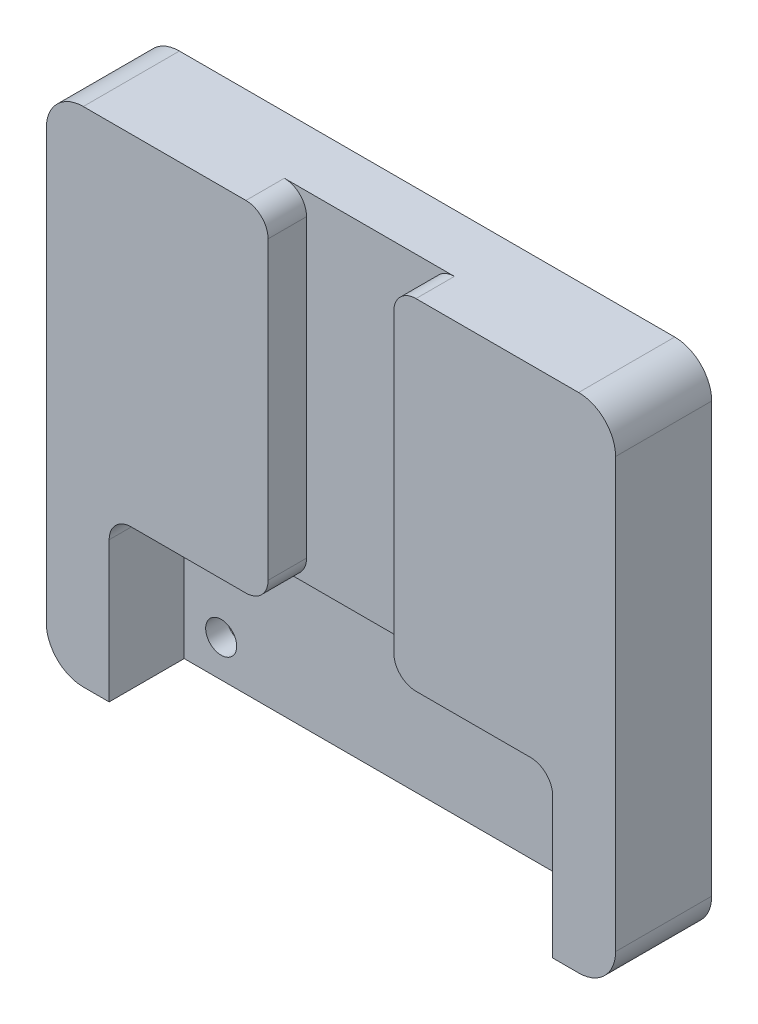
ISO-10303-21;
HEADER;
FILE_DESCRIPTION(('STEP AP214'),'2;1');
FILE_NAME('part.step','',(''),(''),'','','');
FILE_SCHEMA(('AUTOMOTIVE_DESIGN { 1 0 10303 214 1 1 1 1 }'));
ENDSEC;
DATA;
#1=APPLICATION_CONTEXT('core data for automotive mechanical design processes');
#2=APPLICATION_PROTOCOL_DEFINITION('international standard','automotive_design',2000,#1);
#3=PRODUCT_CONTEXT('',#1,'mechanical');
#4=PRODUCT('Part','Part','',(#3));
#5=PRODUCT_RELATED_PRODUCT_CATEGORY('part','',(#4));
#6=PRODUCT_DEFINITION_FORMATION('','',#4);
#7=PRODUCT_DEFINITION_CONTEXT('part definition',#1,'design');
#8=PRODUCT_DEFINITION('design','',#6,#7);
#9=PRODUCT_DEFINITION_SHAPE('','',#8);
#10=(LENGTH_UNIT() NAMED_UNIT(*) SI_UNIT(.MILLI.,.METRE.));
#11=(NAMED_UNIT(*) PLANE_ANGLE_UNIT() SI_UNIT($,.RADIAN.));
#12=(NAMED_UNIT(*) SI_UNIT($,.STERADIAN.) SOLID_ANGLE_UNIT());
#13=UNCERTAINTY_MEASURE_WITH_UNIT(LENGTH_MEASURE(1.E-05),#10,'distance_accuracy_value','');
#14=(GEOMETRIC_REPRESENTATION_CONTEXT(3) GLOBAL_UNCERTAINTY_ASSIGNED_CONTEXT((#13)) GLOBAL_UNIT_ASSIGNED_CONTEXT((#10,
#11,#12)) REPRESENTATION_CONTEXT('',''));
#15=CARTESIAN_POINT('',(0.,0.,0.));
#16=DIRECTION('',(0.,0.,1.));
#17=DIRECTION('',(1.,0.,0.));
#18=AXIS2_PLACEMENT_3D('',#15,#16,#17);
#19=CARTESIAN_POINT('',(77.,0.,13.));
#20=DIRECTION('',(0.,0.,-1.));
#21=DIRECTION('',(-1.,0.,0.));
#22=AXIS2_PLACEMENT_3D('',#19,#20,#21);
#23=PLANE('',#22);
#24=DIRECTION('',(0.,-1.,0.));
#25=VECTOR('',#24,1.);
#26=CARTESIAN_POINT('',(30.,68.,13.));
#27=LINE('',#26,#25);
#28=CARTESIAN_POINT('',(30.,65.,13.));
#29=VERTEX_POINT('',#28);
#30=CARTESIAN_POINT('',(30.,25.,13.));
#31=VERTEX_POINT('',#30);
#32=EDGE_CURVE('E408',#29,#31,#27,.T.);
#33=ORIENTED_EDGE('',*,*,#32,.F.);
#34=CARTESIAN_POINT('',(27.,65.,13.));
#35=DIRECTION('',(0.,0.,-1.));
#36=DIRECTION('',(-1.,0.,0.));
#37=AXIS2_PLACEMENT_3D('',#34,#35,#36);
#38=CIRCLE('',#37,3.);
#39=CARTESIAN_POINT('',(27.,68.,13.));
#40=VERTEX_POINT('',#39);
#41=EDGE_CURVE('E312',#29,#40,#38,.F.);
#42=ORIENTED_EDGE('',*,*,#41,.T.);
#43=DIRECTION('',(-1.,0.,0.));
#44=VECTOR('',#43,1.);
#45=CARTESIAN_POINT('',(77.,68.,13.));
#46=LINE('',#45,#44);
#47=CARTESIAN_POINT('',(5.,68.,13.));
#48=VERTEX_POINT('',#47);
#49=EDGE_CURVE('E244',#40,#48,#46,.T.);
#50=ORIENTED_EDGE('',*,*,#49,.T.);
#51=CARTESIAN_POINT('',(5.,63.,13.));
#52=DIRECTION('',(0.,0.,-1.));
#53=DIRECTION('',(-1.,0.,0.));
#54=AXIS2_PLACEMENT_3D('',#51,#52,#53);
#55=CIRCLE('',#54,5.);
#56=CARTESIAN_POINT('',(0.,63.,13.));
#57=VERTEX_POINT('',#56);
#58=EDGE_CURVE('E265',#48,#57,#55,.F.);
#59=ORIENTED_EDGE('',*,*,#58,.T.);
#60=DIRECTION('',(0.,-1.,0.));
#61=VECTOR('',#60,1.);
#62=CARTESIAN_POINT('',(0.,0.,13.));
#63=LINE('',#62,#61);
#64=CARTESIAN_POINT('',(0.,5.,13.));
#65=VERTEX_POINT('',#64);
#66=EDGE_CURVE('E234',#57,#65,#63,.T.);
#67=ORIENTED_EDGE('',*,*,#66,.T.);
#68=CARTESIAN_POINT('',(5.,5.,13.));
#69=DIRECTION('',(0.,0.,-1.));
#70=DIRECTION('',(-1.,0.,0.));
#71=AXIS2_PLACEMENT_3D('',#68,#69,#70);
#72=CIRCLE('',#71,5.);
#73=CARTESIAN_POINT('',(5.,0.,13.));
#74=VERTEX_POINT('',#73);
#75=EDGE_CURVE('E261',#65,#74,#72,.F.);
#76=ORIENTED_EDGE('',*,*,#75,.T.);
#77=DIRECTION('',(-1.,0.,0.));
#78=VECTOR('',#77,1.);
#79=CARTESIAN_POINT('',(77.,0.,13.));
#80=LINE('',#79,#78);
#81=CARTESIAN_POINT('',(8.49999999999999,0.,13.));
#82=VERTEX_POINT('',#81);
#83=EDGE_CURVE('E237',#82,#74,#80,.T.);
#84=ORIENTED_EDGE('',*,*,#83,.F.);
#85=DIRECTION('',(0.,-1.,0.));
#86=VECTOR('',#85,1.);
#87=CARTESIAN_POINT('',(8.49999999999999,0.,13.));
#88=LINE('',#87,#86);
#89=CARTESIAN_POINT('',(8.5,19.,13.));
#90=VERTEX_POINT('',#89);
#91=EDGE_CURVE('E206',#90,#82,#88,.T.);
#92=ORIENTED_EDGE('',*,*,#91,.F.);
#93=CARTESIAN_POINT('',(11.5,19.,13.));
#94=DIRECTION('',(0.,0.,-1.));
#95=DIRECTION('',(-1.,0.,0.));
#96=AXIS2_PLACEMENT_3D('',#93,#94,#95);
#97=CIRCLE('',#96,3.);
#98=CARTESIAN_POINT('',(11.5,22.,13.));
#99=VERTEX_POINT('',#98);
#100=EDGE_CURVE('E11',#90,#99,#97,.T.);
#101=ORIENTED_EDGE('',*,*,#100,.T.);
#102=DIRECTION('',(-1.,0.,0.));
#103=VECTOR('',#102,1.);
#104=CARTESIAN_POINT('',(8.5,22.,13.));
#105=LINE('',#104,#103);
#106=CARTESIAN_POINT('',(27.,22.,13.));
#107=VERTEX_POINT('',#106);
#108=EDGE_CURVE('E225',#107,#99,#105,.T.);
#109=ORIENTED_EDGE('',*,*,#108,.F.);
#110=CARTESIAN_POINT('',(27.,25.,13.));
#111=DIRECTION('',(0.,0.,-1.));
#112=DIRECTION('',(-1.,0.,0.));
#113=AXIS2_PLACEMENT_3D('',#110,#111,#112);
#114=CIRCLE('',#113,3.);
#115=EDGE_CURVE('E310',#107,#31,#114,.F.);
#116=ORIENTED_EDGE('',*,*,#115,.T.);
#117=EDGE_LOOP('',(#33,#42,#50,#59,#67,#76,#84,#92,#101,#109,#116));
#118=FACE_BOUND('',#117,.T.);
#119=ADVANCED_FACE('F43',(#118),#23,.F.);
#120=CARTESIAN_POINT('',(77.,0.,0.));
#121=DIRECTION('',(0.,1.,0.));
#122=DIRECTION('',(0.,0.,1.));
#123=AXIS2_PLACEMENT_3D('',#120,#121,#122);
#124=PLANE('',#123);
#125=ORIENTED_EDGE('',*,*,#83,.T.);
#126=DIRECTION('',(0.,0.,-1.));
#127=VECTOR('',#126,1.);
#128=CARTESIAN_POINT('',(5.,0.,0.));
#129=LINE('',#128,#127);
#130=CARTESIAN_POINT('',(5.,0.,0.));
#131=VERTEX_POINT('',#130);
#132=EDGE_CURVE('E287',#74,#131,#129,.T.);
#133=ORIENTED_EDGE('',*,*,#132,.T.);
#134=DIRECTION('',(-1.,0.,0.));
#135=VECTOR('',#134,1.);
#136=CARTESIAN_POINT('',(77.,0.,0.));
#137=LINE('',#136,#135);
#138=CARTESIAN_POINT('',(72.,0.,0.));
#139=VERTEX_POINT('',#138);
#140=EDGE_CURVE('E251',#139,#131,#137,.T.);
#141=ORIENTED_EDGE('',*,*,#140,.F.);
#142=DIRECTION('',(0.,0.,-1.));
#143=VECTOR('',#142,1.);
#144=CARTESIAN_POINT('',(72.,0.,0.));
#145=LINE('',#144,#143);
#146=CARTESIAN_POINT('',(72.,0.,13.));
#147=VERTEX_POINT('',#146);
#148=EDGE_CURVE('E285',#139,#147,#145,.F.);
#149=ORIENTED_EDGE('',*,*,#148,.T.);
#150=CARTESIAN_POINT('',(68.5,0.,13.));
#151=VERTEX_POINT('',#150);
#152=EDGE_CURVE('E242',#147,#151,#80,.T.);
#153=ORIENTED_EDGE('',*,*,#152,.T.);
#154=DIRECTION('',(0.,0.,1.));
#155=VECTOR('',#154,1.);
#156=CARTESIAN_POINT('',(68.5,0.,2.85));
#157=LINE('',#156,#155);
#158=CARTESIAN_POINT('',(68.5,0.,2.85));
#159=VERTEX_POINT('',#158);
#160=EDGE_CURVE('E210',#159,#151,#157,.T.);
#161=ORIENTED_EDGE('',*,*,#160,.F.);
#162=DIRECTION('',(1.,0.,0.));
#163=VECTOR('',#162,1.);
#164=CARTESIAN_POINT('',(8.49999999999999,0.,2.85));
#165=LINE('',#164,#163);
#166=CARTESIAN_POINT('',(8.49999999999999,0.,2.85));
#167=VERTEX_POINT('',#166);
#168=EDGE_CURVE('E195',#167,#159,#165,.T.);
#169=ORIENTED_EDGE('',*,*,#168,.F.);
#170=DIRECTION('',(0.,0.,1.));
#171=VECTOR('',#170,1.);
#172=CARTESIAN_POINT('',(8.49999999999999,0.,2.85));
#173=LINE('',#172,#171);
#174=EDGE_CURVE('E203',#167,#82,#173,.T.);
#175=ORIENTED_EDGE('',*,*,#174,.T.);
#176=EDGE_LOOP('',(#125,#133,#141,#149,#153,#161,#169,#175));
#177=FACE_BOUND('',#176,.T.);
#178=ADVANCED_FACE('F213',(#177),#124,.F.);
#179=CARTESIAN_POINT('',(77.,0.,0.));
#180=DIRECTION('',(0.,0.,1.));
#181=DIRECTION('',(1.,0.,0.));
#182=AXIS2_PLACEMENT_3D('',#179,#180,#181);
#183=PLANE('',#182);
#184=CARTESIAN_POINT('',(63.4999999999999,19.,0.));
#185=DIRECTION('',(0.,0.,1.));
#186=DIRECTION('',(1.,0.,0.));
#187=AXIS2_PLACEMENT_3D('',#184,#185,#186);
#188=CIRCLE('',#187,2.1);
#189=CARTESIAN_POINT('',(65.6,19.,0.));
#190=VERTEX_POINT('',#189);
#191=EDGE_CURVE('E422',#190,#190,#188,.T.);
#192=ORIENTED_EDGE('',*,*,#191,.T.);
#193=EDGE_LOOP('',(#192));
#194=FACE_BOUND('',#193,.T.);
#195=CARTESIAN_POINT('',(13.4999999999999,18.9999999999997,0.));
#196=DIRECTION('',(0.,0.,1.));
#197=DIRECTION('',(1.,0.,0.));
#198=AXIS2_PLACEMENT_3D('',#195,#196,#197);
#199=CIRCLE('',#198,2.1);
#200=CARTESIAN_POINT('',(15.5999999999999,18.9999999999997,0.));
#201=VERTEX_POINT('',#200);
#202=EDGE_CURVE('E426',#201,#201,#199,.T.);
#203=ORIENTED_EDGE('',*,*,#202,.T.);
#204=EDGE_LOOP('',(#203));
#205=FACE_BOUND('',#204,.T.);
#206=CARTESIAN_POINT('',(13.5,4.99999999999965,0.));
#207=DIRECTION('',(0.,0.,1.));
#208=DIRECTION('',(1.,0.,0.));
#209=AXIS2_PLACEMENT_3D('',#206,#207,#208);
#210=CIRCLE('',#209,2.1);
#211=CARTESIAN_POINT('',(15.6,4.99999999999965,0.));
#212=VERTEX_POINT('',#211);
#213=EDGE_CURVE('E431',#212,#212,#210,.T.);
#214=ORIENTED_EDGE('',*,*,#213,.T.);
#215=EDGE_LOOP('',(#214));
#216=FACE_BOUND('',#215,.T.);
#217=CARTESIAN_POINT('',(63.5,5.,0.));
#218=DIRECTION('',(0.,0.,1.));
#219=DIRECTION('',(1.,0.,0.));
#220=AXIS2_PLACEMENT_3D('',#217,#218,#219);
#221=CIRCLE('',#220,2.1);
#222=CARTESIAN_POINT('',(65.6,5.,0.));
#223=VERTEX_POINT('',#222);
#224=EDGE_CURVE('E592',#223,#223,#221,.T.);
#225=ORIENTED_EDGE('',*,*,#224,.T.);
#226=EDGE_LOOP('',(#225));
#227=FACE_BOUND('',#226,.T.);
#228=DIRECTION('',(0.,1.,0.));
#229=VECTOR('',#228,1.);
#230=CARTESIAN_POINT('',(0.,0.,0.));
#231=LINE('',#230,#229);
#232=CARTESIAN_POINT('',(0.,5.,0.));
#233=VERTEX_POINT('',#232);
#234=CARTESIAN_POINT('',(0.,63.,0.));
#235=VERTEX_POINT('',#234);
#236=EDGE_CURVE('E228',#233,#235,#231,.T.);
#237=ORIENTED_EDGE('',*,*,#236,.T.);
#238=CARTESIAN_POINT('',(5.,63.,0.));
#239=DIRECTION('',(0.,0.,1.));
#240=DIRECTION('',(1.,0.,0.));
#241=AXIS2_PLACEMENT_3D('',#238,#239,#240);
#242=CIRCLE('',#241,5.);
#243=CARTESIAN_POINT('',(5.,68.,0.));
#244=VERTEX_POINT('',#243);
#245=EDGE_CURVE('E277',#235,#244,#242,.F.);
#246=ORIENTED_EDGE('',*,*,#245,.T.);
#247=DIRECTION('',(-1.,0.,0.));
#248=VECTOR('',#247,1.);
#249=CARTESIAN_POINT('',(77.,68.,0.));
#250=LINE('',#249,#248);
#251=CARTESIAN_POINT('',(72.,68.,0.));
#252=VERTEX_POINT('',#251);
#253=EDGE_CURVE('E248',#252,#244,#250,.T.);
#254=ORIENTED_EDGE('',*,*,#253,.F.);
#255=CARTESIAN_POINT('',(72.,63.,0.));
#256=DIRECTION('',(0.,0.,1.));
#257=DIRECTION('',(1.,0.,0.));
#258=AXIS2_PLACEMENT_3D('',#255,#256,#257);
#259=CIRCLE('',#258,5.);
#260=CARTESIAN_POINT('',(77.,63.,0.));
#261=VERTEX_POINT('',#260);
#262=EDGE_CURVE('E275',#252,#261,#259,.F.);
#263=ORIENTED_EDGE('',*,*,#262,.T.);
#264=DIRECTION('',(0.,1.,0.));
#265=VECTOR('',#264,1.);
#266=CARTESIAN_POINT('',(77.,0.,0.));
#267=LINE('',#266,#265);
#268=CARTESIAN_POINT('',(77.,5.,0.));
#269=VERTEX_POINT('',#268);
#270=EDGE_CURVE('E230',#269,#261,#267,.T.);
#271=ORIENTED_EDGE('',*,*,#270,.F.);
#272=CARTESIAN_POINT('',(72.,5.,0.));
#273=DIRECTION('',(0.,0.,1.));
#274=DIRECTION('',(1.,0.,0.));
#275=AXIS2_PLACEMENT_3D('',#272,#273,#274);
#276=CIRCLE('',#275,5.);
#277=EDGE_CURVE('E271',#269,#139,#276,.F.);
#278=ORIENTED_EDGE('',*,*,#277,.T.);
#279=ORIENTED_EDGE('',*,*,#140,.T.);
#280=CARTESIAN_POINT('',(5.,5.,0.));
#281=DIRECTION('',(0.,0.,1.));
#282=DIRECTION('',(1.,0.,0.));
#283=AXIS2_PLACEMENT_3D('',#280,#281,#282);
#284=CIRCLE('',#283,5.);
#285=EDGE_CURVE('E273',#131,#233,#284,.F.);
#286=ORIENTED_EDGE('',*,*,#285,.T.);
#287=EDGE_LOOP('',(#237,#246,#254,#263,#271,#278,#279,#286));
#288=FACE_BOUND('',#287,.T.);
#289=ADVANCED_FACE('F367',(#194,#205,#216,#227,#288),#183,.F.);
#290=CARTESIAN_POINT('',(77.,68.,0.));
#291=DIRECTION('',(0.,-1.,0.));
#292=DIRECTION('',(0.,0.,-1.));
#293=AXIS2_PLACEMENT_3D('',#290,#291,#292);
#294=PLANE('',#293);
#295=DIRECTION('',(-1.,0.,0.));
#296=VECTOR('',#295,1.);
#297=CARTESIAN_POINT('',(30.,68.,7.8));
#298=LINE('',#297,#296);
#299=CARTESIAN_POINT('',(50.,68.,7.8));
#300=VERTEX_POINT('',#299);
#301=CARTESIAN_POINT('',(27.,68.,7.8));
#302=VERTEX_POINT('',#301);
#303=EDGE_CURVE('E223',#300,#302,#298,.T.);
#304=ORIENTED_EDGE('',*,*,#303,.F.);
#305=DIRECTION('',(0.,0.,1.));
#306=VECTOR('',#305,1.);
#307=CARTESIAN_POINT('',(50.,68.,0.));
#308=LINE('',#307,#306);
#309=CARTESIAN_POINT('',(50.,68.,13.));
#310=VERTEX_POINT('',#309);
#311=EDGE_CURVE('E293',#300,#310,#308,.T.);
#312=ORIENTED_EDGE('',*,*,#311,.T.);
#313=CARTESIAN_POINT('',(72.,68.,13.));
#314=VERTEX_POINT('',#313);
#315=EDGE_CURVE('E245',#314,#310,#46,.T.);
#316=ORIENTED_EDGE('',*,*,#315,.F.);
#317=DIRECTION('',(0.,0.,1.));
#318=VECTOR('',#317,1.);
#319=CARTESIAN_POINT('',(72.,68.,0.));
#320=LINE('',#319,#318);
#321=EDGE_CURVE('E254',#314,#252,#320,.F.);
#322=ORIENTED_EDGE('',*,*,#321,.T.);
#323=ORIENTED_EDGE('',*,*,#253,.T.);
#324=DIRECTION('',(0.,0.,1.));
#325=VECTOR('',#324,1.);
#326=CARTESIAN_POINT('',(5.,68.,13.));
#327=LINE('',#326,#325);
#328=EDGE_CURVE('E256',#244,#48,#327,.T.);
#329=ORIENTED_EDGE('',*,*,#328,.T.);
#330=ORIENTED_EDGE('',*,*,#49,.F.);
#331=DIRECTION('',(0.,0.,1.));
#332=VECTOR('',#331,1.);
#333=CARTESIAN_POINT('',(27.,68.,0.));
#334=LINE('',#333,#332);
#335=EDGE_CURVE('E290',#40,#302,#334,.F.);
#336=ORIENTED_EDGE('',*,*,#335,.T.);
#337=EDGE_LOOP('',(#304,#312,#316,#322,#323,#329,#330,#336));
#338=FACE_BOUND('',#337,.T.);
#339=ADVANCED_FACE('F380',(#338),#294,.F.);
#340=ORIENTED_EDGE('',*,*,#315,.T.);
#341=CARTESIAN_POINT('',(50.,65.,13.));
#342=DIRECTION('',(0.,0.,-1.));
#343=DIRECTION('',(-1.,0.,0.));
#344=AXIS2_PLACEMENT_3D('',#341,#342,#343);
#345=CIRCLE('',#344,3.);
#346=CARTESIAN_POINT('',(47.,65.,13.));
#347=VERTEX_POINT('',#346);
#348=EDGE_CURVE('E298',#310,#347,#345,.F.);
#349=ORIENTED_EDGE('',*,*,#348,.T.);
#350=DIRECTION('',(0.,1.,0.));
#351=VECTOR('',#350,1.);
#352=CARTESIAN_POINT('',(47.,68.,13.));
#353=LINE('',#352,#351);
#354=CARTESIAN_POINT('',(47.,25.,13.));
#355=VERTEX_POINT('',#354);
#356=EDGE_CURVE('E398',#355,#347,#353,.T.);
#357=ORIENTED_EDGE('',*,*,#356,.F.);
#358=CARTESIAN_POINT('',(50.,25.,13.));
#359=DIRECTION('',(0.,0.,-1.));
#360=DIRECTION('',(-1.,0.,0.));
#361=AXIS2_PLACEMENT_3D('',#358,#359,#360);
#362=CIRCLE('',#361,3.);
#363=CARTESIAN_POINT('',(50.,22.,13.));
#364=VERTEX_POINT('',#363);
#365=EDGE_CURVE('E296',#355,#364,#362,.F.);
#366=ORIENTED_EDGE('',*,*,#365,.T.);
#367=CARTESIAN_POINT('',(65.5,22.,13.));
#368=VERTEX_POINT('',#367);
#369=EDGE_CURVE('E200',#368,#364,#105,.T.);
#370=ORIENTED_EDGE('',*,*,#369,.F.);
#371=CARTESIAN_POINT('',(65.5,19.,13.));
#372=DIRECTION('',(0.,0.,-1.));
#373=DIRECTION('',(-1.,0.,0.));
#374=AXIS2_PLACEMENT_3D('',#371,#372,#373);
#375=CIRCLE('',#374,3.);
#376=CARTESIAN_POINT('',(68.5,19.,13.));
#377=VERTEX_POINT('',#376);
#378=EDGE_CURVE('E51',#368,#377,#375,.T.);
#379=ORIENTED_EDGE('',*,*,#378,.T.);
#380=DIRECTION('',(0.,1.,0.));
#381=VECTOR('',#380,1.);
#382=CARTESIAN_POINT('',(68.5,0.,13.));
#383=LINE('',#382,#381);
#384=EDGE_CURVE('E222',#151,#377,#383,.T.);
#385=ORIENTED_EDGE('',*,*,#384,.F.);
#386=ORIENTED_EDGE('',*,*,#152,.F.);
#387=CARTESIAN_POINT('',(72.,5.,13.));
#388=DIRECTION('',(0.,0.,-1.));
#389=DIRECTION('',(-1.,0.,0.));
#390=AXIS2_PLACEMENT_3D('',#387,#388,#389);
#391=CIRCLE('',#390,5.);
#392=CARTESIAN_POINT('',(77.,5.,13.));
#393=VERTEX_POINT('',#392);
#394=EDGE_CURVE('E259',#147,#393,#391,.F.);
#395=ORIENTED_EDGE('',*,*,#394,.T.);
#396=DIRECTION('',(0.,-1.,0.));
#397=VECTOR('',#396,1.);
#398=CARTESIAN_POINT('',(77.,0.,13.));
#399=LINE('',#398,#397);
#400=CARTESIAN_POINT('',(77.,63.,13.));
#401=VERTEX_POINT('',#400);
#402=EDGE_CURVE('E233',#401,#393,#399,.T.);
#403=ORIENTED_EDGE('',*,*,#402,.F.);
#404=CARTESIAN_POINT('',(72.,63.,13.));
#405=DIRECTION('',(0.,0.,-1.));
#406=DIRECTION('',(-1.,0.,0.));
#407=AXIS2_PLACEMENT_3D('',#404,#405,#406);
#408=CIRCLE('',#407,5.);
#409=EDGE_CURVE('E263',#401,#314,#408,.F.);
#410=ORIENTED_EDGE('',*,*,#409,.T.);
#411=EDGE_LOOP('',(#340,#349,#357,#366,#370,#379,#385,#386,#395,#403,#410));
#412=FACE_BOUND('',#411,.T.);
#413=ADVANCED_FACE('F343',(#412),#23,.F.);
#414=CARTESIAN_POINT('',(77.,0.,0.));
#415=DIRECTION('',(-1.,0.,0.));
#416=DIRECTION('',(0.,0.,1.));
#417=AXIS2_PLACEMENT_3D('',#414,#415,#416);
#418=PLANE('',#417);
#419=ORIENTED_EDGE('',*,*,#270,.T.);
#420=DIRECTION('',(0.,0.,1.));
#421=VECTOR('',#420,1.);
#422=CARTESIAN_POINT('',(77.,63.,0.));
#423=LINE('',#422,#421);
#424=EDGE_CURVE('E282',#261,#401,#423,.T.);
#425=ORIENTED_EDGE('',*,*,#424,.T.);
#426=ORIENTED_EDGE('',*,*,#402,.T.);
#427=DIRECTION('',(0.,0.,-1.));
#428=VECTOR('',#427,1.);
#429=CARTESIAN_POINT('',(77.,5.,0.));
#430=LINE('',#429,#428);
#431=EDGE_CURVE('E279',#393,#269,#430,.T.);
#432=ORIENTED_EDGE('',*,*,#431,.T.);
#433=EDGE_LOOP('',(#419,#425,#426,#432));
#434=FACE_BOUND('',#433,.T.);
#435=ADVANCED_FACE('F389',(#434),#418,.F.);
#436=CARTESIAN_POINT('',(0.,0.,0.));
#437=DIRECTION('',(-1.,0.,0.));
#438=DIRECTION('',(0.,0.,1.));
#439=AXIS2_PLACEMENT_3D('',#436,#437,#438);
#440=PLANE('',#439);
#441=ORIENTED_EDGE('',*,*,#66,.F.);
#442=DIRECTION('',(0.,0.,1.));
#443=VECTOR('',#442,1.);
#444=CARTESIAN_POINT('',(0.,63.,0.));
#445=LINE('',#444,#443);
#446=EDGE_CURVE('E269',#57,#235,#445,.F.);
#447=ORIENTED_EDGE('',*,*,#446,.T.);
#448=ORIENTED_EDGE('',*,*,#236,.F.);
#449=DIRECTION('',(0.,0.,-1.));
#450=VECTOR('',#449,1.);
#451=CARTESIAN_POINT('',(0.,5.,13.));
#452=LINE('',#451,#450);
#453=EDGE_CURVE('E267',#233,#65,#452,.F.);
#454=ORIENTED_EDGE('',*,*,#453,.T.);
#455=EDGE_LOOP('',(#441,#447,#448,#454));
#456=FACE_BOUND('',#455,.T.);
#457=ADVANCED_FACE('F371',(#456),#440,.T.);
#458=CARTESIAN_POINT('',(8.49999999999999,0.,2.85));
#459=DIRECTION('',(-1.,0.,0.));
#460=DIRECTION('',(0.,-1.,0.));
#461=AXIS2_PLACEMENT_3D('',#458,#459,#460);
#462=PLANE('',#461);
#463=DIRECTION('',(0.,-1.,0.));
#464=VECTOR('',#463,1.);
#465=CARTESIAN_POINT('',(8.49999999999999,0.,2.85));
#466=LINE('',#465,#464);
#467=CARTESIAN_POINT('',(8.5,19.,2.85));
#468=VERTEX_POINT('',#467);
#469=EDGE_CURVE('E191',#468,#167,#466,.T.);
#470=ORIENTED_EDGE('',*,*,#469,.F.);
#471=DIRECTION('',(0.,0.,1.));
#472=VECTOR('',#471,1.);
#473=CARTESIAN_POINT('',(8.5,19.,13.));
#474=LINE('',#473,#472);
#475=EDGE_CURVE('E329',#468,#90,#474,.T.);
#476=ORIENTED_EDGE('',*,*,#475,.T.);
#477=ORIENTED_EDGE('',*,*,#91,.T.);
#478=ORIENTED_EDGE('',*,*,#174,.F.);
#479=EDGE_LOOP('',(#470,#476,#477,#478));
#480=FACE_BOUND('',#479,.T.);
#481=ADVANCED_FACE('F204',(#480),#462,.F.);
#482=CARTESIAN_POINT('',(8.5,22.,2.85));
#483=DIRECTION('',(0.,1.,0.));
#484=DIRECTION('',(0.,0.,1.));
#485=AXIS2_PLACEMENT_3D('',#482,#483,#484);
#486=PLANE('',#485);
#487=DIRECTION('',(1.,0.,0.));
#488=VECTOR('',#487,1.);
#489=CARTESIAN_POINT('',(30.,22.,7.8));
#490=LINE('',#489,#488);
#491=CARTESIAN_POINT('',(27.,22.,7.8));
#492=VERTEX_POINT('',#491);
#493=CARTESIAN_POINT('',(50.,22.,7.8));
#494=VERTEX_POINT('',#493);
#495=EDGE_CURVE('E415',#492,#494,#490,.T.);
#496=ORIENTED_EDGE('',*,*,#495,.F.);
#497=DIRECTION('',(0.,0.,1.));
#498=VECTOR('',#497,1.);
#499=CARTESIAN_POINT('',(27.,22.,2.85));
#500=LINE('',#499,#498);
#501=EDGE_CURVE('E322',#492,#107,#500,.T.);
#502=ORIENTED_EDGE('',*,*,#501,.T.);
#503=ORIENTED_EDGE('',*,*,#108,.T.);
#504=DIRECTION('',(0.,0.,1.));
#505=VECTOR('',#504,1.);
#506=CARTESIAN_POINT('',(11.5,22.,2.85));
#507=LINE('',#506,#505);
#508=CARTESIAN_POINT('',(11.5,22.,2.85));
#509=VERTEX_POINT('',#508);
#510=EDGE_CURVE('E314',#99,#509,#507,.F.);
#511=ORIENTED_EDGE('',*,*,#510,.T.);
#512=DIRECTION('',(-1.,0.,0.));
#513=VECTOR('',#512,1.);
#514=CARTESIAN_POINT('',(8.5,22.,2.85));
#515=LINE('',#514,#513);
#516=CARTESIAN_POINT('',(65.5,22.,2.85));
#517=VERTEX_POINT('',#516);
#518=EDGE_CURVE('E211',#517,#509,#515,.T.);
#519=ORIENTED_EDGE('',*,*,#518,.F.);
#520=DIRECTION('',(0.,0.,1.));
#521=VECTOR('',#520,1.);
#522=CARTESIAN_POINT('',(65.5,22.,13.));
#523=LINE('',#522,#521);
#524=EDGE_CURVE('E316',#517,#368,#523,.T.);
#525=ORIENTED_EDGE('',*,*,#524,.T.);
#526=ORIENTED_EDGE('',*,*,#369,.T.);
#527=DIRECTION('',(0.,0.,1.));
#528=VECTOR('',#527,1.);
#529=CARTESIAN_POINT('',(50.,22.,2.85));
#530=LINE('',#529,#528);
#531=EDGE_CURVE('E319',#364,#494,#530,.F.);
#532=ORIENTED_EDGE('',*,*,#531,.T.);
#533=EDGE_LOOP('',(#496,#502,#503,#511,#519,#525,#526,#532));
#534=FACE_BOUND('',#533,.T.);
#535=ADVANCED_FACE('F353',(#534),#486,.F.);
#536=CARTESIAN_POINT('',(68.5,0.,2.85));
#537=DIRECTION('',(1.,0.,0.));
#538=DIRECTION('',(0.,0.,-1.));
#539=AXIS2_PLACEMENT_3D('',#536,#537,#538);
#540=PLANE('',#539);
#541=ORIENTED_EDGE('',*,*,#384,.T.);
#542=DIRECTION('',(0.,0.,1.));
#543=VECTOR('',#542,1.);
#544=CARTESIAN_POINT('',(68.5,19.,2.85));
#545=LINE('',#544,#543);
#546=CARTESIAN_POINT('',(68.5,19.,2.85));
#547=VERTEX_POINT('',#546);
#548=EDGE_CURVE('E66',#377,#547,#545,.F.);
#549=ORIENTED_EDGE('',*,*,#548,.T.);
#550=DIRECTION('',(0.,1.,0.));
#551=VECTOR('',#550,1.);
#552=CARTESIAN_POINT('',(68.5,0.,2.85));
#553=LINE('',#552,#551);
#554=EDGE_CURVE('E215',#159,#547,#553,.T.);
#555=ORIENTED_EDGE('',*,*,#554,.F.);
#556=ORIENTED_EDGE('',*,*,#160,.T.);
#557=EDGE_LOOP('',(#541,#549,#555,#556));
#558=FACE_BOUND('',#557,.T.);
#559=ADVANCED_FACE('F348',(#558),#540,.F.);
#560=CARTESIAN_POINT('',(0.,0.,2.85));
#561=DIRECTION('',(0.,0.,-1.));
#562=DIRECTION('',(-1.,0.,0.));
#563=AXIS2_PLACEMENT_3D('',#560,#561,#562);
#564=PLANE('',#563);
#565=CARTESIAN_POINT('',(63.4999999999999,19.,2.85));
#566=DIRECTION('',(0.,0.,1.));
#567=DIRECTION('',(1.,0.,0.));
#568=AXIS2_PLACEMENT_3D('',#565,#566,#567);
#569=CIRCLE('',#568,2.1);
#570=CARTESIAN_POINT('',(65.6,19.,2.85));
#571=VERTEX_POINT('',#570);
#572=EDGE_CURVE('E581',#571,#571,#569,.T.);
#573=ORIENTED_EDGE('',*,*,#572,.F.);
#574=EDGE_LOOP('',(#573));
#575=FACE_BOUND('',#574,.T.);
#576=CARTESIAN_POINT('',(13.4999999999999,18.9999999999997,2.85));
#577=DIRECTION('',(0.,0.,1.));
#578=DIRECTION('',(1.,0.,0.));
#579=AXIS2_PLACEMENT_3D('',#576,#577,#578);
#580=CIRCLE('',#579,2.1);
#581=CARTESIAN_POINT('',(15.5999999999999,18.9999999999997,2.85));
#582=VERTEX_POINT('',#581);
#583=EDGE_CURVE('E583',#582,#582,#580,.T.);
#584=ORIENTED_EDGE('',*,*,#583,.F.);
#585=EDGE_LOOP('',(#584));
#586=FACE_BOUND('',#585,.T.);
#587=CARTESIAN_POINT('',(13.5,4.99999999999965,2.85));
#588=DIRECTION('',(0.,0.,1.));
#589=DIRECTION('',(1.,0.,0.));
#590=AXIS2_PLACEMENT_3D('',#587,#588,#589);
#591=CIRCLE('',#590,2.1);
#592=CARTESIAN_POINT('',(15.6,4.99999999999965,2.85));
#593=VERTEX_POINT('',#592);
#594=EDGE_CURVE('E586',#593,#593,#591,.T.);
#595=ORIENTED_EDGE('',*,*,#594,.F.);
#596=EDGE_LOOP('',(#595));
#597=FACE_BOUND('',#596,.T.);
#598=CARTESIAN_POINT('',(63.5,5.,2.85));
#599=DIRECTION('',(0.,0.,1.));
#600=DIRECTION('',(1.,0.,0.));
#601=AXIS2_PLACEMENT_3D('',#598,#599,#600);
#602=CIRCLE('',#601,2.1);
#603=CARTESIAN_POINT('',(65.6,5.,2.85));
#604=VERTEX_POINT('',#603);
#605=EDGE_CURVE('E590',#604,#604,#602,.T.);
#606=ORIENTED_EDGE('',*,*,#605,.F.);
#607=EDGE_LOOP('',(#606));
#608=FACE_BOUND('',#607,.T.);
#609=ORIENTED_EDGE('',*,*,#554,.T.);
#610=CARTESIAN_POINT('',(65.5,19.,2.85));
#611=DIRECTION('',(0.,0.,-1.));
#612=DIRECTION('',(-1.,0.,0.));
#613=AXIS2_PLACEMENT_3D('',#610,#611,#612);
#614=CIRCLE('',#613,3.);
#615=EDGE_CURVE('E327',#547,#517,#614,.F.);
#616=ORIENTED_EDGE('',*,*,#615,.T.);
#617=ORIENTED_EDGE('',*,*,#518,.T.);
#618=CARTESIAN_POINT('',(11.5,19.,2.85));
#619=DIRECTION('',(0.,0.,-1.));
#620=DIRECTION('',(-1.,0.,0.));
#621=AXIS2_PLACEMENT_3D('',#618,#619,#620);
#622=CIRCLE('',#621,3.);
#623=EDGE_CURVE('E58',#509,#468,#622,.F.);
#624=ORIENTED_EDGE('',*,*,#623,.T.);
#625=ORIENTED_EDGE('',*,*,#469,.T.);
#626=ORIENTED_EDGE('',*,*,#168,.T.);
#627=EDGE_LOOP('',(#609,#616,#617,#624,#625,#626));
#628=FACE_BOUND('',#627,.T.);
#629=ADVANCED_FACE('F193',(#575,#586,#597,#608,#628),#564,.F.);
#630=CARTESIAN_POINT('',(5.,63.,0.));
#631=DIRECTION('',(0.,0.,-1.));
#632=DIRECTION('',(-1.,0.,0.));
#633=AXIS2_PLACEMENT_3D('',#630,#631,#632);
#634=CYLINDRICAL_SURFACE('',#633,5.);
#635=ORIENTED_EDGE('',*,*,#245,.F.);
#636=ORIENTED_EDGE('',*,*,#446,.F.);
#637=ORIENTED_EDGE('',*,*,#58,.F.);
#638=ORIENTED_EDGE('',*,*,#328,.F.);
#639=EDGE_LOOP('',(#635,#636,#637,#638));
#640=FACE_BOUND('',#639,.T.);
#641=ADVANCED_FACE('F375',(#640),#634,.T.);
#642=CARTESIAN_POINT('',(72.,63.,0.));
#643=DIRECTION('',(0.,0.,1.));
#644=DIRECTION('',(1.,0.,0.));
#645=AXIS2_PLACEMENT_3D('',#642,#643,#644);
#646=CYLINDRICAL_SURFACE('',#645,5.);
#647=ORIENTED_EDGE('',*,*,#262,.F.);
#648=ORIENTED_EDGE('',*,*,#321,.F.);
#649=ORIENTED_EDGE('',*,*,#409,.F.);
#650=ORIENTED_EDGE('',*,*,#424,.F.);
#651=EDGE_LOOP('',(#647,#648,#649,#650));
#652=FACE_BOUND('',#651,.T.);
#653=ADVANCED_FACE('F385',(#652),#646,.T.);
#654=CARTESIAN_POINT('',(5.,5.,0.));
#655=DIRECTION('',(0.,0.,1.));
#656=DIRECTION('',(1.,0.,0.));
#657=AXIS2_PLACEMENT_3D('',#654,#655,#656);
#658=CYLINDRICAL_SURFACE('',#657,5.);
#659=ORIENTED_EDGE('',*,*,#75,.F.);
#660=ORIENTED_EDGE('',*,*,#453,.F.);
#661=ORIENTED_EDGE('',*,*,#285,.F.);
#662=ORIENTED_EDGE('',*,*,#132,.F.);
#663=EDGE_LOOP('',(#659,#660,#661,#662));
#664=FACE_BOUND('',#663,.T.);
#665=ADVANCED_FACE('F363',(#664),#658,.T.);
#666=CARTESIAN_POINT('',(72.,5.,0.));
#667=DIRECTION('',(0.,0.,-1.));
#668=DIRECTION('',(-1.,0.,0.));
#669=AXIS2_PLACEMENT_3D('',#666,#667,#668);
#670=CYLINDRICAL_SURFACE('',#669,5.);
#671=ORIENTED_EDGE('',*,*,#394,.F.);
#672=ORIENTED_EDGE('',*,*,#148,.F.);
#673=ORIENTED_EDGE('',*,*,#277,.F.);
#674=ORIENTED_EDGE('',*,*,#431,.F.);
#675=EDGE_LOOP('',(#671,#672,#673,#674));
#676=FACE_BOUND('',#675,.T.);
#677=ADVANCED_FACE('F394',(#676),#670,.T.);
#678=CARTESIAN_POINT('',(30.,68.,7.8));
#679=DIRECTION('',(-1.,0.,0.));
#680=DIRECTION('',(0.,-1.,0.));
#681=AXIS2_PLACEMENT_3D('',#678,#679,#680);
#682=PLANE('',#681);
#683=DIRECTION('',(0.,-1.,0.));
#684=VECTOR('',#683,1.);
#685=CARTESIAN_POINT('',(30.,68.,7.8));
#686=LINE('',#685,#684);
#687=CARTESIAN_POINT('',(30.,65.,7.8));
#688=VERTEX_POINT('',#687);
#689=CARTESIAN_POINT('',(30.,25.,7.8));
#690=VERTEX_POINT('',#689);
#691=EDGE_CURVE('E407',#688,#690,#686,.T.);
#692=ORIENTED_EDGE('',*,*,#691,.F.);
#693=DIRECTION('',(0.,0.,1.));
#694=VECTOR('',#693,1.);
#695=CARTESIAN_POINT('',(30.,65.,7.8));
#696=LINE('',#695,#694);
#697=EDGE_CURVE('E307',#688,#29,#696,.T.);
#698=ORIENTED_EDGE('',*,*,#697,.T.);
#699=ORIENTED_EDGE('',*,*,#32,.T.);
#700=DIRECTION('',(0.,0.,1.));
#701=VECTOR('',#700,1.);
#702=CARTESIAN_POINT('',(30.,25.,7.8));
#703=LINE('',#702,#701);
#704=EDGE_CURVE('E305',#31,#690,#703,.F.);
#705=ORIENTED_EDGE('',*,*,#704,.T.);
#706=EDGE_LOOP('',(#692,#698,#699,#705));
#707=FACE_BOUND('',#706,.T.);
#708=ADVANCED_FACE('F445',(#707),#682,.F.);
#709=CARTESIAN_POINT('',(47.,68.,7.8));
#710=DIRECTION('',(1.,0.,0.));
#711=DIRECTION('',(0.,1.,0.));
#712=AXIS2_PLACEMENT_3D('',#709,#710,#711);
#713=PLANE('',#712);
#714=ORIENTED_EDGE('',*,*,#356,.T.);
#715=DIRECTION('',(0.,0.,1.));
#716=VECTOR('',#715,1.);
#717=CARTESIAN_POINT('',(47.,65.,7.8));
#718=LINE('',#717,#716);
#719=CARTESIAN_POINT('',(47.,65.,7.8));
#720=VERTEX_POINT('',#719);
#721=EDGE_CURVE('E303',#347,#720,#718,.F.);
#722=ORIENTED_EDGE('',*,*,#721,.T.);
#723=DIRECTION('',(0.,1.,0.));
#724=VECTOR('',#723,1.);
#725=CARTESIAN_POINT('',(47.,68.,7.8));
#726=LINE('',#725,#724);
#727=CARTESIAN_POINT('',(47.,25.,7.8));
#728=VERTEX_POINT('',#727);
#729=EDGE_CURVE('E413',#728,#720,#726,.T.);
#730=ORIENTED_EDGE('',*,*,#729,.F.);
#731=DIRECTION('',(0.,0.,1.));
#732=VECTOR('',#731,1.);
#733=CARTESIAN_POINT('',(47.,25.,7.8));
#734=LINE('',#733,#732);
#735=EDGE_CURVE('E300',#728,#355,#734,.T.);
#736=ORIENTED_EDGE('',*,*,#735,.T.);
#737=EDGE_LOOP('',(#714,#722,#730,#736));
#738=FACE_BOUND('',#737,.T.);
#739=ADVANCED_FACE('F403',(#738),#713,.F.);
#740=CARTESIAN_POINT('',(0.,0.,7.8));
#741=DIRECTION('',(0.,0.,1.));
#742=DIRECTION('',(1.,0.,0.));
#743=AXIS2_PLACEMENT_3D('',#740,#741,#742);
#744=PLANE('',#743);
#745=ORIENTED_EDGE('',*,*,#303,.T.);
#746=CARTESIAN_POINT('',(27.,65.,7.8));
#747=DIRECTION('',(0.,0.,1.));
#748=DIRECTION('',(1.,0.,0.));
#749=AXIS2_PLACEMENT_3D('',#746,#747,#748);
#750=CIRCLE('',#749,3.);
#751=EDGE_CURVE('E334',#302,#688,#750,.F.);
#752=ORIENTED_EDGE('',*,*,#751,.T.);
#753=ORIENTED_EDGE('',*,*,#691,.T.);
#754=CARTESIAN_POINT('',(27.,25.,7.8));
#755=DIRECTION('',(0.,0.,1.));
#756=DIRECTION('',(1.,0.,0.));
#757=AXIS2_PLACEMENT_3D('',#754,#755,#756);
#758=CIRCLE('',#757,3.);
#759=EDGE_CURVE('E336',#690,#492,#758,.F.);
#760=ORIENTED_EDGE('',*,*,#759,.T.);
#761=ORIENTED_EDGE('',*,*,#495,.T.);
#762=CARTESIAN_POINT('',(50.,25.,7.8));
#763=DIRECTION('',(0.,0.,1.));
#764=DIRECTION('',(1.,0.,0.));
#765=AXIS2_PLACEMENT_3D('',#762,#763,#764);
#766=CIRCLE('',#765,3.);
#767=EDGE_CURVE('E339',#494,#728,#766,.F.);
#768=ORIENTED_EDGE('',*,*,#767,.T.);
#769=ORIENTED_EDGE('',*,*,#729,.T.);
#770=CARTESIAN_POINT('',(50.,65.,7.8));
#771=DIRECTION('',(0.,0.,1.));
#772=DIRECTION('',(1.,0.,0.));
#773=AXIS2_PLACEMENT_3D('',#770,#771,#772);
#774=CIRCLE('',#773,3.);
#775=EDGE_CURVE('E331',#720,#300,#774,.F.);
#776=ORIENTED_EDGE('',*,*,#775,.T.);
#777=EDGE_LOOP('',(#745,#752,#753,#760,#761,#768,#769,#776));
#778=FACE_BOUND('',#777,.T.);
#779=ADVANCED_FACE('F412',(#778),#744,.T.);
#780=CARTESIAN_POINT('',(50.,65.,0.));
#781=DIRECTION('',(0.,0.,1.));
#782=DIRECTION('',(1.,0.,0.));
#783=AXIS2_PLACEMENT_3D('',#780,#781,#782);
#784=CYLINDRICAL_SURFACE('',#783,3.);
#785=ORIENTED_EDGE('',*,*,#775,.F.);
#786=ORIENTED_EDGE('',*,*,#721,.F.);
#787=ORIENTED_EDGE('',*,*,#348,.F.);
#788=ORIENTED_EDGE('',*,*,#311,.F.);
#789=EDGE_LOOP('',(#785,#786,#787,#788));
#790=FACE_BOUND('',#789,.T.);
#791=ADVANCED_FACE('F410',(#790),#784,.T.);
#792=CARTESIAN_POINT('',(27.,65.,7.8));
#793=DIRECTION('',(0.,0.,1.));
#794=DIRECTION('',(1.,0.,0.));
#795=AXIS2_PLACEMENT_3D('',#792,#793,#794);
#796=CYLINDRICAL_SURFACE('',#795,3.);
#797=ORIENTED_EDGE('',*,*,#751,.F.);
#798=ORIENTED_EDGE('',*,*,#335,.F.);
#799=ORIENTED_EDGE('',*,*,#41,.F.);
#800=ORIENTED_EDGE('',*,*,#697,.F.);
#801=EDGE_LOOP('',(#797,#798,#799,#800));
#802=FACE_BOUND('',#801,.T.);
#803=ADVANCED_FACE('F444',(#802),#796,.T.);
#804=CARTESIAN_POINT('',(27.,25.,2.85));
#805=DIRECTION('',(0.,0.,1.));
#806=DIRECTION('',(1.,0.,0.));
#807=AXIS2_PLACEMENT_3D('',#804,#805,#806);
#808=CYLINDRICAL_SURFACE('',#807,3.);
#809=ORIENTED_EDGE('',*,*,#759,.F.);
#810=ORIENTED_EDGE('',*,*,#704,.F.);
#811=ORIENTED_EDGE('',*,*,#115,.F.);
#812=ORIENTED_EDGE('',*,*,#501,.F.);
#813=EDGE_LOOP('',(#809,#810,#811,#812));
#814=FACE_BOUND('',#813,.T.);
#815=ADVANCED_FACE('F441',(#814),#808,.T.);
#816=CARTESIAN_POINT('',(50.,25.,7.8));
#817=DIRECTION('',(0.,0.,1.));
#818=DIRECTION('',(1.,0.,0.));
#819=AXIS2_PLACEMENT_3D('',#816,#817,#818);
#820=CYLINDRICAL_SURFACE('',#819,3.);
#821=ORIENTED_EDGE('',*,*,#767,.F.);
#822=ORIENTED_EDGE('',*,*,#531,.F.);
#823=ORIENTED_EDGE('',*,*,#365,.F.);
#824=ORIENTED_EDGE('',*,*,#735,.F.);
#825=EDGE_LOOP('',(#821,#822,#823,#824));
#826=FACE_BOUND('',#825,.T.);
#827=ADVANCED_FACE('F488',(#826),#820,.T.);
#828=CARTESIAN_POINT('',(65.5,19.,2.85));
#829=DIRECTION('',(0.,0.,-1.));
#830=DIRECTION('',(-1.,0.,0.));
#831=AXIS2_PLACEMENT_3D('',#828,#829,#830);
#832=CYLINDRICAL_SURFACE('',#831,3.);
#833=ORIENTED_EDGE('',*,*,#615,.F.);
#834=ORIENTED_EDGE('',*,*,#548,.F.);
#835=ORIENTED_EDGE('',*,*,#378,.F.);
#836=ORIENTED_EDGE('',*,*,#524,.F.);
#837=EDGE_LOOP('',(#833,#834,#835,#836));
#838=FACE_BOUND('',#837,.T.);
#839=ADVANCED_FACE('F350',(#838),#832,.F.);
#840=CARTESIAN_POINT('',(11.5,19.,2.85));
#841=DIRECTION('',(0.,0.,-1.));
#842=DIRECTION('',(-1.,0.,0.));
#843=AXIS2_PLACEMENT_3D('',#840,#841,#842);
#844=CYLINDRICAL_SURFACE('',#843,3.);
#845=ORIENTED_EDGE('',*,*,#623,.F.);
#846=ORIENTED_EDGE('',*,*,#510,.F.);
#847=ORIENTED_EDGE('',*,*,#100,.F.);
#848=ORIENTED_EDGE('',*,*,#475,.F.);
#849=EDGE_LOOP('',(#845,#846,#847,#848));
#850=FACE_BOUND('',#849,.T.);
#851=ADVANCED_FACE('F45',(#850),#844,.F.);
#852=CARTESIAN_POINT('',(63.5,5.,-1.75));
#853=DIRECTION('',(0.,0.,1.));
#854=DIRECTION('',(1.,0.,0.));
#855=AXIS2_PLACEMENT_3D('',#852,#853,#854);
#856=CYLINDRICAL_SURFACE('',#855,2.1);
#857=ORIENTED_EDGE('',*,*,#605,.T.);
#858=EDGE_LOOP('',(#857));
#859=FACE_BOUND('',#858,.T.);
#860=ORIENTED_EDGE('',*,*,#224,.F.);
#861=EDGE_LOOP('',(#860));
#862=FACE_BOUND('',#861,.T.);
#863=ADVANCED_FACE('F495',(#859,#862),#856,.F.);
#864=CARTESIAN_POINT('',(13.5,4.99999999999965,-1.75));
#865=DIRECTION('',(0.,0.,1.));
#866=DIRECTION('',(1.,0.,0.));
#867=AXIS2_PLACEMENT_3D('',#864,#865,#866);
#868=CYLINDRICAL_SURFACE('',#867,2.1);
#869=ORIENTED_EDGE('',*,*,#594,.T.);
#870=EDGE_LOOP('',(#869));
#871=FACE_BOUND('',#870,.T.);
#872=ORIENTED_EDGE('',*,*,#213,.F.);
#873=EDGE_LOOP('',(#872));
#874=FACE_BOUND('',#873,.T.);
#875=ADVANCED_FACE('F499',(#871,#874),#868,.F.);
#876=CARTESIAN_POINT('',(13.4999999999999,18.9999999999997,-1.75));
#877=DIRECTION('',(0.,0.,1.));
#878=DIRECTION('',(1.,0.,0.));
#879=AXIS2_PLACEMENT_3D('',#876,#877,#878);
#880=CYLINDRICAL_SURFACE('',#879,2.1);
#881=ORIENTED_EDGE('',*,*,#583,.T.);
#882=EDGE_LOOP('',(#881));
#883=FACE_BOUND('',#882,.T.);
#884=ORIENTED_EDGE('',*,*,#202,.F.);
#885=EDGE_LOOP('',(#884));
#886=FACE_BOUND('',#885,.T.);
#887=ADVANCED_FACE('F506',(#883,#886),#880,.F.);
#888=CARTESIAN_POINT('',(63.4999999999999,19.,-1.75));
#889=DIRECTION('',(0.,0.,1.));
#890=DIRECTION('',(1.,0.,0.));
#891=AXIS2_PLACEMENT_3D('',#888,#889,#890);
#892=CYLINDRICAL_SURFACE('',#891,2.1);
#893=ORIENTED_EDGE('',*,*,#572,.T.);
#894=EDGE_LOOP('',(#893));
#895=FACE_BOUND('',#894,.T.);
#896=ORIENTED_EDGE('',*,*,#191,.F.);
#897=EDGE_LOOP('',(#896));
#898=FACE_BOUND('',#897,.T.);
#899=ADVANCED_FACE('F513',(#895,#898),#892,.F.);
#900=CLOSED_SHELL('',(#119,#178,#289,#339,#413,#435,#457,#481,#535,#559,#629,#641,#653,#665,
#677,#708,#739,#779,#791,#803,#815,#827,#839,#851,#863,#875,#887,#899));
#901=MANIFOLD_SOLID_BREP('B2',#900);
#902=ADVANCED_BREP_SHAPE_REPRESENTATION('',(#18,#901),#14);
#903=SHAPE_DEFINITION_REPRESENTATION(#9,#902);
ENDSEC;
END-ISO-10303-21;
